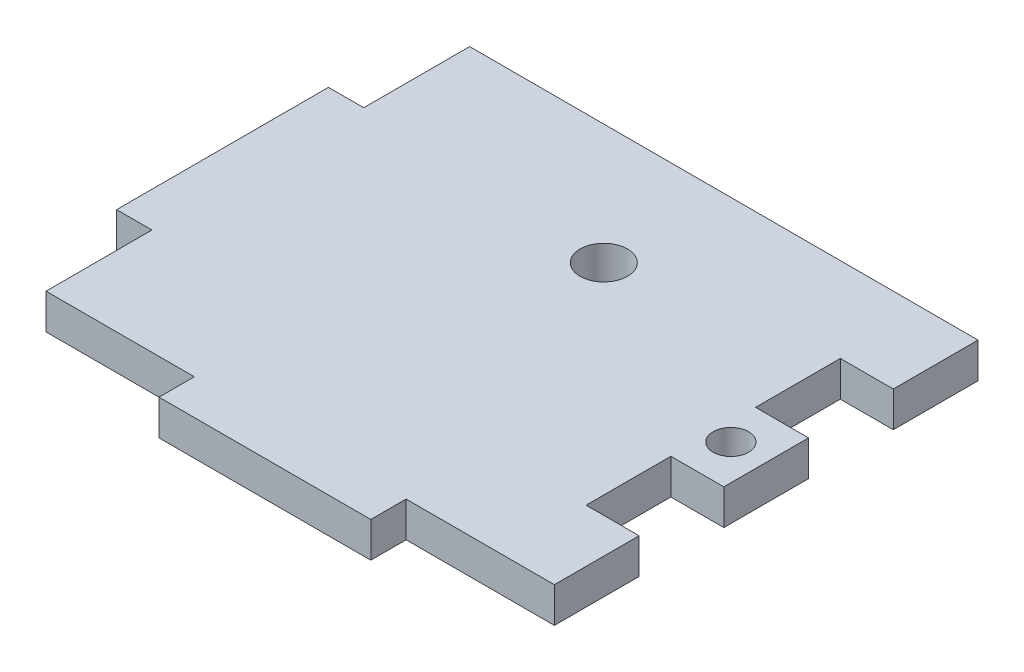
ISO-10303-21;
HEADER;
FILE_DESCRIPTION(('STEP AP214'),'2;1');
FILE_NAME('part.step','',(''),(''),'','','');
FILE_SCHEMA(('AUTOMOTIVE_DESIGN { 1 0 10303 214 1 1 1 1 }'));
ENDSEC;
DATA;
#1=APPLICATION_CONTEXT('core data for automotive mechanical design processes');
#2=APPLICATION_PROTOCOL_DEFINITION('international standard','automotive_design',2000,#1);
#3=PRODUCT_CONTEXT('',#1,'mechanical');
#4=PRODUCT('Part','Part','',(#3));
#5=PRODUCT_RELATED_PRODUCT_CATEGORY('part','',(#4));
#6=PRODUCT_DEFINITION_FORMATION('','',#4);
#7=PRODUCT_DEFINITION_CONTEXT('part definition',#1,'design');
#8=PRODUCT_DEFINITION('design','',#6,#7);
#9=PRODUCT_DEFINITION_SHAPE('','',#8);
#10=(LENGTH_UNIT() NAMED_UNIT(*) SI_UNIT(.MILLI.,.METRE.));
#11=(NAMED_UNIT(*) PLANE_ANGLE_UNIT() SI_UNIT($,.RADIAN.));
#12=(NAMED_UNIT(*) SI_UNIT($,.STERADIAN.) SOLID_ANGLE_UNIT());
#13=UNCERTAINTY_MEASURE_WITH_UNIT(LENGTH_MEASURE(1.E-05),#10,'distance_accuracy_value','');
#14=(GEOMETRIC_REPRESENTATION_CONTEXT(3) GLOBAL_UNCERTAINTY_ASSIGNED_CONTEXT((#13)) GLOBAL_UNIT_ASSIGNED_CONTEXT((#10,
#11,#12)) REPRESENTATION_CONTEXT('',''));
#15=CARTESIAN_POINT('',(0.,0.,0.));
#16=DIRECTION('',(0.,0.,1.));
#17=DIRECTION('',(1.,0.,0.));
#18=AXIS2_PLACEMENT_3D('',#15,#16,#17);
#19=CARTESIAN_POINT('',(0.,3.175,-9.525));
#20=DIRECTION('',(1.,0.,0.));
#21=DIRECTION('',(0.,0.,-1.));
#22=AXIS2_PLACEMENT_3D('',#19,#20,#21);
#23=PLANE('',#22);
#24=DIRECTION('',(0.,0.,1.));
#25=VECTOR('',#24,1.);
#26=CARTESIAN_POINT('',(0.,0.,-9.525));
#27=LINE('',#26,#25);
#28=CARTESIAN_POINT('',(0.,0.,-9.525));
#29=VERTEX_POINT('',#28);
#30=CARTESIAN_POINT('',(0.,0.,0.));
#31=VERTEX_POINT('',#30);
#32=EDGE_CURVE('E201',#29,#31,#27,.T.);
#33=ORIENTED_EDGE('',*,*,#32,.T.);
#34=DIRECTION('',(0.,-1.,0.));
#35=VECTOR('',#34,1.);
#36=CARTESIAN_POINT('',(0.,3.175,0.));
#37=LINE('',#36,#35);
#38=CARTESIAN_POINT('',(0.,3.175,0.));
#39=VERTEX_POINT('',#38);
#40=EDGE_CURVE('E11',#39,#31,#37,.T.);
#41=ORIENTED_EDGE('',*,*,#40,.F.);
#42=DIRECTION('',(0.,0.,1.));
#43=VECTOR('',#42,1.);
#44=CARTESIAN_POINT('',(0.,3.175,-9.525));
#45=LINE('',#44,#43);
#46=CARTESIAN_POINT('',(0.,3.175,-9.525));
#47=VERTEX_POINT('',#46);
#48=EDGE_CURVE('E240',#47,#39,#45,.T.);
#49=ORIENTED_EDGE('',*,*,#48,.F.);
#50=DIRECTION('',(0.,-1.,0.));
#51=VECTOR('',#50,1.);
#52=CARTESIAN_POINT('',(0.,3.175,-9.525));
#53=LINE('',#52,#51);
#54=EDGE_CURVE('E197',#47,#29,#53,.T.);
#55=ORIENTED_EDGE('',*,*,#54,.T.);
#56=EDGE_LOOP('',(#33,#41,#49,#55));
#57=FACE_BOUND('',#56,.T.);
#58=ADVANCED_FACE('F33',(#57),#23,.F.);
#59=CARTESIAN_POINT('',(0.,3.175,0.));
#60=DIRECTION('',(0.,0.,-1.));
#61=DIRECTION('',(-1.,0.,0.));
#62=AXIS2_PLACEMENT_3D('',#59,#60,#61);
#63=PLANE('',#62);
#64=DIRECTION('',(1.,0.,0.));
#65=VECTOR('',#64,1.);
#66=CARTESIAN_POINT('',(0.,0.,0.));
#67=LINE('',#66,#65);
#68=CARTESIAN_POINT('',(13.335,0.,0.));
#69=VERTEX_POINT('',#68);
#70=EDGE_CURVE('E204',#31,#69,#67,.T.);
#71=ORIENTED_EDGE('',*,*,#70,.T.);
#72=DIRECTION('',(0.,-1.,0.));
#73=VECTOR('',#72,1.);
#74=CARTESIAN_POINT('',(13.335,3.175,0.));
#75=LINE('',#74,#73);
#76=CARTESIAN_POINT('',(13.335,3.175,0.));
#77=VERTEX_POINT('',#76);
#78=EDGE_CURVE('E41',#77,#69,#75,.T.);
#79=ORIENTED_EDGE('',*,*,#78,.F.);
#80=DIRECTION('',(1.,0.,0.));
#81=VECTOR('',#80,1.);
#82=CARTESIAN_POINT('',(0.,3.175,0.));
#83=LINE('',#82,#81);
#84=EDGE_CURVE('E128',#39,#77,#83,.T.);
#85=ORIENTED_EDGE('',*,*,#84,.F.);
#86=ORIENTED_EDGE('',*,*,#40,.T.);
#87=EDGE_LOOP('',(#71,#79,#85,#86));
#88=FACE_BOUND('',#87,.T.);
#89=ADVANCED_FACE('F359',(#88),#63,.F.);
#90=CARTESIAN_POINT('',(13.335,3.175,0.));
#91=DIRECTION('',(1.,0.,0.));
#92=DIRECTION('',(0.,0.,-1.));
#93=AXIS2_PLACEMENT_3D('',#90,#91,#92);
#94=PLANE('',#93);
#95=DIRECTION('',(0.,0.,1.));
#96=VECTOR('',#95,1.);
#97=CARTESIAN_POINT('',(13.335,0.,0.));
#98=LINE('',#97,#96);
#99=CARTESIAN_POINT('',(13.335,0.,3.175));
#100=VERTEX_POINT('',#99);
#101=EDGE_CURVE('E207',#69,#100,#98,.T.);
#102=ORIENTED_EDGE('',*,*,#101,.T.);
#103=DIRECTION('',(0.,-1.,0.));
#104=VECTOR('',#103,1.);
#105=CARTESIAN_POINT('',(13.335,3.175,3.175));
#106=LINE('',#105,#104);
#107=CARTESIAN_POINT('',(13.335,3.175,3.175));
#108=VERTEX_POINT('',#107);
#109=EDGE_CURVE('E283',#108,#100,#106,.T.);
#110=ORIENTED_EDGE('',*,*,#109,.F.);
#111=DIRECTION('',(0.,0.,1.));
#112=VECTOR('',#111,1.);
#113=CARTESIAN_POINT('',(13.335,3.175,0.));
#114=LINE('',#113,#112);
#115=EDGE_CURVE('E291',#77,#108,#114,.T.);
#116=ORIENTED_EDGE('',*,*,#115,.F.);
#117=ORIENTED_EDGE('',*,*,#78,.T.);
#118=EDGE_LOOP('',(#102,#110,#116,#117));
#119=FACE_BOUND('',#118,.T.);
#120=ADVANCED_FACE('F289',(#119),#94,.F.);
#121=CARTESIAN_POINT('',(13.335,3.175,3.175));
#122=DIRECTION('',(0.,0.,-1.));
#123=DIRECTION('',(-1.,0.,0.));
#124=AXIS2_PLACEMENT_3D('',#121,#122,#123);
#125=PLANE('',#124);
#126=DIRECTION('',(1.,0.,0.));
#127=VECTOR('',#126,1.);
#128=CARTESIAN_POINT('',(13.335,0.,3.175));
#129=LINE('',#128,#127);
#130=CARTESIAN_POINT('',(32.385,0.,3.175));
#131=VERTEX_POINT('',#130);
#132=EDGE_CURVE('E209',#100,#131,#129,.T.);
#133=ORIENTED_EDGE('',*,*,#132,.T.);
#134=DIRECTION('',(0.,-1.,0.));
#135=VECTOR('',#134,1.);
#136=CARTESIAN_POINT('',(32.385,3.175,3.175));
#137=LINE('',#136,#135);
#138=CARTESIAN_POINT('',(32.385,3.175,3.175));
#139=VERTEX_POINT('',#138);
#140=EDGE_CURVE('E280',#139,#131,#137,.T.);
#141=ORIENTED_EDGE('',*,*,#140,.F.);
#142=DIRECTION('',(1.,0.,0.));
#143=VECTOR('',#142,1.);
#144=CARTESIAN_POINT('',(13.335,3.175,3.175));
#145=LINE('',#144,#143);
#146=EDGE_CURVE('E309',#108,#139,#145,.T.);
#147=ORIENTED_EDGE('',*,*,#146,.F.);
#148=ORIENTED_EDGE('',*,*,#109,.T.);
#149=EDGE_LOOP('',(#133,#141,#147,#148));
#150=FACE_BOUND('',#149,.T.);
#151=ADVANCED_FACE('F300',(#150),#125,.F.);
#152=CARTESIAN_POINT('',(32.385,3.175,3.175));
#153=DIRECTION('',(-1.,0.,0.));
#154=DIRECTION('',(0.,0.,1.));
#155=AXIS2_PLACEMENT_3D('',#152,#153,#154);
#156=PLANE('',#155);
#157=DIRECTION('',(0.,0.,-1.));
#158=VECTOR('',#157,1.);
#159=CARTESIAN_POINT('',(32.385,0.,3.175));
#160=LINE('',#159,#158);
#161=CARTESIAN_POINT('',(32.385,0.,0.));
#162=VERTEX_POINT('',#161);
#163=EDGE_CURVE('E211',#131,#162,#160,.T.);
#164=ORIENTED_EDGE('',*,*,#163,.T.);
#165=DIRECTION('',(0.,-1.,0.));
#166=VECTOR('',#165,1.);
#167=CARTESIAN_POINT('',(32.385,3.175,0.));
#168=LINE('',#167,#166);
#169=CARTESIAN_POINT('',(32.385,3.175,0.));
#170=VERTEX_POINT('',#169);
#171=EDGE_CURVE('E277',#170,#162,#168,.T.);
#172=ORIENTED_EDGE('',*,*,#171,.F.);
#173=DIRECTION('',(0.,0.,-1.));
#174=VECTOR('',#173,1.);
#175=CARTESIAN_POINT('',(32.385,3.175,3.175));
#176=LINE('',#175,#174);
#177=EDGE_CURVE('E306',#139,#170,#176,.T.);
#178=ORIENTED_EDGE('',*,*,#177,.F.);
#179=ORIENTED_EDGE('',*,*,#140,.T.);
#180=EDGE_LOOP('',(#164,#172,#178,#179));
#181=FACE_BOUND('',#180,.T.);
#182=ADVANCED_FACE('F304',(#181),#156,.F.);
#183=CARTESIAN_POINT('',(32.385,3.175,0.));
#184=DIRECTION('',(0.,0.,-1.));
#185=DIRECTION('',(-1.,0.,0.));
#186=AXIS2_PLACEMENT_3D('',#183,#184,#185);
#187=PLANE('',#186);
#188=DIRECTION('',(1.,0.,0.));
#189=VECTOR('',#188,1.);
#190=CARTESIAN_POINT('',(32.385,0.,0.));
#191=LINE('',#190,#189);
#192=CARTESIAN_POINT('',(45.72,0.,0.));
#193=VERTEX_POINT('',#192);
#194=EDGE_CURVE('E213',#162,#193,#191,.T.);
#195=ORIENTED_EDGE('',*,*,#194,.T.);
#196=DIRECTION('',(0.,-1.,0.));
#197=VECTOR('',#196,1.);
#198=CARTESIAN_POINT('',(45.72,3.175,0.));
#199=LINE('',#198,#197);
#200=CARTESIAN_POINT('',(45.72,3.175,0.));
#201=VERTEX_POINT('',#200);
#202=EDGE_CURVE('E274',#201,#193,#199,.T.);
#203=ORIENTED_EDGE('',*,*,#202,.F.);
#204=DIRECTION('',(1.,0.,0.));
#205=VECTOR('',#204,1.);
#206=CARTESIAN_POINT('',(32.385,3.175,0.));
#207=LINE('',#206,#205);
#208=EDGE_CURVE('E308',#170,#201,#207,.T.);
#209=ORIENTED_EDGE('',*,*,#208,.F.);
#210=ORIENTED_EDGE('',*,*,#171,.T.);
#211=EDGE_LOOP('',(#195,#203,#209,#210));
#212=FACE_BOUND('',#211,.T.);
#213=ADVANCED_FACE('F372',(#212),#187,.F.);
#214=CARTESIAN_POINT('',(45.72,3.175,0.));
#215=DIRECTION('',(-1.,0.,0.));
#216=DIRECTION('',(0.,0.,1.));
#217=AXIS2_PLACEMENT_3D('',#214,#215,#216);
#218=PLANE('',#217);
#219=DIRECTION('',(0.,0.,-1.));
#220=VECTOR('',#219,1.);
#221=CARTESIAN_POINT('',(45.72,0.,0.));
#222=LINE('',#221,#220);
#223=CARTESIAN_POINT('',(45.72,0.,-7.62));
#224=VERTEX_POINT('',#223);
#225=EDGE_CURVE('E215',#193,#224,#222,.T.);
#226=ORIENTED_EDGE('',*,*,#225,.T.);
#227=DIRECTION('',(0.,-1.,0.));
#228=VECTOR('',#227,1.);
#229=CARTESIAN_POINT('',(45.72,3.175,-7.62));
#230=LINE('',#229,#228);
#231=CARTESIAN_POINT('',(45.72,3.175,-7.62));
#232=VERTEX_POINT('',#231);
#233=EDGE_CURVE('E271',#232,#224,#230,.T.);
#234=ORIENTED_EDGE('',*,*,#233,.F.);
#235=DIRECTION('',(0.,0.,-1.));
#236=VECTOR('',#235,1.);
#237=CARTESIAN_POINT('',(45.72,3.175,0.));
#238=LINE('',#237,#236);
#239=EDGE_CURVE('E311',#201,#232,#238,.T.);
#240=ORIENTED_EDGE('',*,*,#239,.F.);
#241=ORIENTED_EDGE('',*,*,#202,.T.);
#242=EDGE_LOOP('',(#226,#234,#240,#241));
#243=FACE_BOUND('',#242,.T.);
#244=ADVANCED_FACE('F375',(#243),#218,.F.);
#245=CARTESIAN_POINT('',(40.9575,3.175,-7.62));
#246=DIRECTION('',(0.,0.,1.));
#247=DIRECTION('',(1.,0.,0.));
#248=AXIS2_PLACEMENT_3D('',#245,#246,#247);
#249=PLANE('',#248);
#250=DIRECTION('',(-1.,0.,0.));
#251=VECTOR('',#250,1.);
#252=CARTESIAN_POINT('',(40.9575,0.,-7.62));
#253=LINE('',#252,#251);
#254=CARTESIAN_POINT('',(40.9575,0.,-7.62));
#255=VERTEX_POINT('',#254);
#256=EDGE_CURVE('E217',#224,#255,#253,.T.);
#257=ORIENTED_EDGE('',*,*,#256,.T.);
#258=DIRECTION('',(0.,-1.,0.));
#259=VECTOR('',#258,1.);
#260=CARTESIAN_POINT('',(40.9575,3.175,-7.62));
#261=LINE('',#260,#259);
#262=CARTESIAN_POINT('',(40.9575,3.175,-7.62));
#263=VERTEX_POINT('',#262);
#264=EDGE_CURVE('E268',#263,#255,#261,.T.);
#265=ORIENTED_EDGE('',*,*,#264,.F.);
#266=DIRECTION('',(-1.,0.,0.));
#267=VECTOR('',#266,1.);
#268=CARTESIAN_POINT('',(40.9575,3.175,-7.62));
#269=LINE('',#268,#267);
#270=EDGE_CURVE('E317',#232,#263,#269,.T.);
#271=ORIENTED_EDGE('',*,*,#270,.F.);
#272=ORIENTED_EDGE('',*,*,#233,.T.);
#273=EDGE_LOOP('',(#257,#265,#271,#272));
#274=FACE_BOUND('',#273,.T.);
#275=ADVANCED_FACE('F379',(#274),#249,.F.);
#276=CARTESIAN_POINT('',(40.9575,3.175,-15.24));
#277=DIRECTION('',(-1.,0.,0.));
#278=DIRECTION('',(0.,0.,1.));
#279=AXIS2_PLACEMENT_3D('',#276,#277,#278);
#280=PLANE('',#279);
#281=DIRECTION('',(0.,0.,-1.));
#282=VECTOR('',#281,1.);
#283=CARTESIAN_POINT('',(40.9575,0.,-15.24));
#284=LINE('',#283,#282);
#285=CARTESIAN_POINT('',(40.9575,0.,-15.24));
#286=VERTEX_POINT('',#285);
#287=EDGE_CURVE('E219',#255,#286,#284,.T.);
#288=ORIENTED_EDGE('',*,*,#287,.T.);
#289=DIRECTION('',(0.,-1.,0.));
#290=VECTOR('',#289,1.);
#291=CARTESIAN_POINT('',(40.9575,3.175,-15.24));
#292=LINE('',#291,#290);
#293=CARTESIAN_POINT('',(40.9575,3.175,-15.24));
#294=VERTEX_POINT('',#293);
#295=EDGE_CURVE('E265',#294,#286,#292,.T.);
#296=ORIENTED_EDGE('',*,*,#295,.F.);
#297=DIRECTION('',(0.,0.,-1.));
#298=VECTOR('',#297,1.);
#299=CARTESIAN_POINT('',(40.9575,3.175,-15.24));
#300=LINE('',#299,#298);
#301=EDGE_CURVE('E319',#263,#294,#300,.T.);
#302=ORIENTED_EDGE('',*,*,#301,.F.);
#303=ORIENTED_EDGE('',*,*,#264,.T.);
#304=EDGE_LOOP('',(#288,#296,#302,#303));
#305=FACE_BOUND('',#304,.T.);
#306=ADVANCED_FACE('F383',(#305),#280,.F.);
#307=CARTESIAN_POINT('',(40.9575,3.175,-15.24));
#308=DIRECTION('',(0.,0.,-1.));
#309=DIRECTION('',(-1.,0.,0.));
#310=AXIS2_PLACEMENT_3D('',#307,#308,#309);
#311=PLANE('',#310);
#312=DIRECTION('',(1.,0.,0.));
#313=VECTOR('',#312,1.);
#314=CARTESIAN_POINT('',(40.9575,0.,-15.24));
#315=LINE('',#314,#313);
#316=CARTESIAN_POINT('',(45.72,0.,-15.24));
#317=VERTEX_POINT('',#316);
#318=EDGE_CURVE('E221',#286,#317,#315,.T.);
#319=ORIENTED_EDGE('',*,*,#318,.T.);
#320=DIRECTION('',(0.,-1.,0.));
#321=VECTOR('',#320,1.);
#322=CARTESIAN_POINT('',(45.72,3.175,-15.24));
#323=LINE('',#322,#321);
#324=CARTESIAN_POINT('',(45.72,3.175,-15.24));
#325=VERTEX_POINT('',#324);
#326=EDGE_CURVE('E262',#325,#317,#323,.T.);
#327=ORIENTED_EDGE('',*,*,#326,.F.);
#328=DIRECTION('',(1.,0.,0.));
#329=VECTOR('',#328,1.);
#330=CARTESIAN_POINT('',(40.9575,3.175,-15.24));
#331=LINE('',#330,#329);
#332=EDGE_CURVE('E321',#294,#325,#331,.T.);
#333=ORIENTED_EDGE('',*,*,#332,.F.);
#334=ORIENTED_EDGE('',*,*,#295,.T.);
#335=EDGE_LOOP('',(#319,#327,#333,#334));
#336=FACE_BOUND('',#335,.T.);
#337=ADVANCED_FACE('F387',(#336),#311,.F.);
#338=CARTESIAN_POINT('',(45.72,3.175,-15.24));
#339=DIRECTION('',(-1.,0.,0.));
#340=DIRECTION('',(0.,0.,1.));
#341=AXIS2_PLACEMENT_3D('',#338,#339,#340);
#342=PLANE('',#341);
#343=DIRECTION('',(0.,0.,-1.));
#344=VECTOR('',#343,1.);
#345=CARTESIAN_POINT('',(45.72,0.,-15.24));
#346=LINE('',#345,#344);
#347=CARTESIAN_POINT('',(45.72,0.,-22.86));
#348=VERTEX_POINT('',#347);
#349=EDGE_CURVE('E223',#317,#348,#346,.T.);
#350=ORIENTED_EDGE('',*,*,#349,.T.);
#351=DIRECTION('',(0.,-1.,0.));
#352=VECTOR('',#351,1.);
#353=CARTESIAN_POINT('',(45.72,3.175,-22.86));
#354=LINE('',#353,#352);
#355=CARTESIAN_POINT('',(45.72,3.175,-22.86));
#356=VERTEX_POINT('',#355);
#357=EDGE_CURVE('E259',#356,#348,#354,.T.);
#358=ORIENTED_EDGE('',*,*,#357,.F.);
#359=DIRECTION('',(0.,0.,-1.));
#360=VECTOR('',#359,1.);
#361=CARTESIAN_POINT('',(45.72,3.175,-15.24));
#362=LINE('',#361,#360);
#363=EDGE_CURVE('E323',#325,#356,#362,.T.);
#364=ORIENTED_EDGE('',*,*,#363,.F.);
#365=ORIENTED_EDGE('',*,*,#326,.T.);
#366=EDGE_LOOP('',(#350,#358,#364,#365));
#367=FACE_BOUND('',#366,.T.);
#368=ADVANCED_FACE('F391',(#367),#342,.F.);
#369=CARTESIAN_POINT('',(40.9575,3.175,-22.86));
#370=DIRECTION('',(0.,0.,1.));
#371=DIRECTION('',(1.,0.,0.));
#372=AXIS2_PLACEMENT_3D('',#369,#370,#371);
#373=PLANE('',#372);
#374=DIRECTION('',(-1.,0.,0.));
#375=VECTOR('',#374,1.);
#376=CARTESIAN_POINT('',(40.9575,0.,-22.86));
#377=LINE('',#376,#375);
#378=CARTESIAN_POINT('',(40.9575,0.,-22.86));
#379=VERTEX_POINT('',#378);
#380=EDGE_CURVE('E225',#348,#379,#377,.T.);
#381=ORIENTED_EDGE('',*,*,#380,.T.);
#382=DIRECTION('',(0.,-1.,0.));
#383=VECTOR('',#382,1.);
#384=CARTESIAN_POINT('',(40.9575,3.175,-22.86));
#385=LINE('',#384,#383);
#386=CARTESIAN_POINT('',(40.9575,3.175,-22.86));
#387=VERTEX_POINT('',#386);
#388=EDGE_CURVE('E256',#387,#379,#385,.T.);
#389=ORIENTED_EDGE('',*,*,#388,.F.);
#390=DIRECTION('',(-1.,0.,0.));
#391=VECTOR('',#390,1.);
#392=CARTESIAN_POINT('',(40.9575,3.175,-22.86));
#393=LINE('',#392,#391);
#394=EDGE_CURVE('E325',#356,#387,#393,.T.);
#395=ORIENTED_EDGE('',*,*,#394,.F.);
#396=ORIENTED_EDGE('',*,*,#357,.T.);
#397=EDGE_LOOP('',(#381,#389,#395,#396));
#398=FACE_BOUND('',#397,.T.);
#399=ADVANCED_FACE('F395',(#398),#373,.F.);
#400=CARTESIAN_POINT('',(40.9575,3.175,-30.48));
#401=DIRECTION('',(-1.,0.,0.));
#402=DIRECTION('',(0.,0.,1.));
#403=AXIS2_PLACEMENT_3D('',#400,#401,#402);
#404=PLANE('',#403);
#405=DIRECTION('',(0.,0.,-1.));
#406=VECTOR('',#405,1.);
#407=CARTESIAN_POINT('',(40.9575,0.,-30.48));
#408=LINE('',#407,#406);
#409=CARTESIAN_POINT('',(40.9575,0.,-30.48));
#410=VERTEX_POINT('',#409);
#411=EDGE_CURVE('E227',#379,#410,#408,.T.);
#412=ORIENTED_EDGE('',*,*,#411,.T.);
#413=DIRECTION('',(0.,-1.,0.));
#414=VECTOR('',#413,1.);
#415=CARTESIAN_POINT('',(40.9575,3.175,-30.48));
#416=LINE('',#415,#414);
#417=CARTESIAN_POINT('',(40.9575,3.175,-30.48));
#418=VERTEX_POINT('',#417);
#419=EDGE_CURVE('E253',#418,#410,#416,.T.);
#420=ORIENTED_EDGE('',*,*,#419,.F.);
#421=DIRECTION('',(0.,0.,-1.));
#422=VECTOR('',#421,1.);
#423=CARTESIAN_POINT('',(40.9575,3.175,-30.48));
#424=LINE('',#423,#422);
#425=EDGE_CURVE('E327',#387,#418,#424,.T.);
#426=ORIENTED_EDGE('',*,*,#425,.F.);
#427=ORIENTED_EDGE('',*,*,#388,.T.);
#428=EDGE_LOOP('',(#412,#420,#426,#427));
#429=FACE_BOUND('',#428,.T.);
#430=ADVANCED_FACE('F399',(#429),#404,.F.);
#431=CARTESIAN_POINT('',(40.9575,3.175,-30.48));
#432=DIRECTION('',(0.,0.,-1.));
#433=DIRECTION('',(-1.,0.,0.));
#434=AXIS2_PLACEMENT_3D('',#431,#432,#433);
#435=PLANE('',#434);
#436=DIRECTION('',(1.,0.,0.));
#437=VECTOR('',#436,1.);
#438=CARTESIAN_POINT('',(40.9575,0.,-30.48));
#439=LINE('',#438,#437);
#440=CARTESIAN_POINT('',(45.72,0.,-30.48));
#441=VERTEX_POINT('',#440);
#442=EDGE_CURVE('E229',#410,#441,#439,.T.);
#443=ORIENTED_EDGE('',*,*,#442,.T.);
#444=DIRECTION('',(0.,-1.,0.));
#445=VECTOR('',#444,1.);
#446=CARTESIAN_POINT('',(45.72,3.175,-30.48));
#447=LINE('',#446,#445);
#448=CARTESIAN_POINT('',(45.72,3.175,-30.48));
#449=VERTEX_POINT('',#448);
#450=EDGE_CURVE('E250',#449,#441,#447,.T.);
#451=ORIENTED_EDGE('',*,*,#450,.F.);
#452=DIRECTION('',(1.,0.,0.));
#453=VECTOR('',#452,1.);
#454=CARTESIAN_POINT('',(40.9575,3.175,-30.48));
#455=LINE('',#454,#453);
#456=EDGE_CURVE('E329',#418,#449,#455,.T.);
#457=ORIENTED_EDGE('',*,*,#456,.F.);
#458=ORIENTED_EDGE('',*,*,#419,.T.);
#459=EDGE_LOOP('',(#443,#451,#457,#458));
#460=FACE_BOUND('',#459,.T.);
#461=ADVANCED_FACE('F403',(#460),#435,.F.);
#462=CARTESIAN_POINT('',(45.72,3.175,-30.48));
#463=DIRECTION('',(-1.,0.,0.));
#464=DIRECTION('',(0.,0.,1.));
#465=AXIS2_PLACEMENT_3D('',#462,#463,#464);
#466=PLANE('',#465);
#467=DIRECTION('',(0.,0.,-1.));
#468=VECTOR('',#467,1.);
#469=CARTESIAN_POINT('',(45.72,0.,-30.48));
#470=LINE('',#469,#468);
#471=CARTESIAN_POINT('',(45.72,0.,-38.1));
#472=VERTEX_POINT('',#471);
#473=EDGE_CURVE('E231',#441,#472,#470,.T.);
#474=ORIENTED_EDGE('',*,*,#473,.T.);
#475=DIRECTION('',(0.,-1.,0.));
#476=VECTOR('',#475,1.);
#477=CARTESIAN_POINT('',(45.72,3.175,-38.1));
#478=LINE('',#477,#476);
#479=CARTESIAN_POINT('',(45.72,3.175,-38.1));
#480=VERTEX_POINT('',#479);
#481=EDGE_CURVE('E247',#480,#472,#478,.T.);
#482=ORIENTED_EDGE('',*,*,#481,.F.);
#483=DIRECTION('',(0.,0.,-1.));
#484=VECTOR('',#483,1.);
#485=CARTESIAN_POINT('',(45.72,3.175,-30.48));
#486=LINE('',#485,#484);
#487=EDGE_CURVE('E331',#449,#480,#486,.T.);
#488=ORIENTED_EDGE('',*,*,#487,.F.);
#489=ORIENTED_EDGE('',*,*,#450,.T.);
#490=EDGE_LOOP('',(#474,#482,#488,#489));
#491=FACE_BOUND('',#490,.T.);
#492=ADVANCED_FACE('F407',(#491),#466,.F.);
#493=CARTESIAN_POINT('',(45.72,3.175,-38.1));
#494=DIRECTION('',(0.,0.,1.));
#495=DIRECTION('',(1.,0.,0.));
#496=AXIS2_PLACEMENT_3D('',#493,#494,#495);
#497=PLANE('',#496);
#498=DIRECTION('',(-1.,0.,0.));
#499=VECTOR('',#498,1.);
#500=CARTESIAN_POINT('',(45.72,0.,-38.1));
#501=LINE('',#500,#499);
#502=CARTESIAN_POINT('',(0.,0.,-38.1));
#503=VERTEX_POINT('',#502);
#504=EDGE_CURVE('E233',#472,#503,#501,.T.);
#505=ORIENTED_EDGE('',*,*,#504,.T.);
#506=DIRECTION('',(0.,-1.,0.));
#507=VECTOR('',#506,1.);
#508=CARTESIAN_POINT('',(0.,3.175,-38.1));
#509=LINE('',#508,#507);
#510=CARTESIAN_POINT('',(0.,3.175,-38.1));
#511=VERTEX_POINT('',#510);
#512=EDGE_CURVE('E244',#511,#503,#509,.T.);
#513=ORIENTED_EDGE('',*,*,#512,.F.);
#514=DIRECTION('',(-1.,0.,0.));
#515=VECTOR('',#514,1.);
#516=CARTESIAN_POINT('',(45.72,3.175,-38.1));
#517=LINE('',#516,#515);
#518=EDGE_CURVE('E333',#480,#511,#517,.T.);
#519=ORIENTED_EDGE('',*,*,#518,.F.);
#520=ORIENTED_EDGE('',*,*,#481,.T.);
#521=EDGE_LOOP('',(#505,#513,#519,#520));
#522=FACE_BOUND('',#521,.T.);
#523=ADVANCED_FACE('F339',(#522),#497,.F.);
#524=CARTESIAN_POINT('',(0.,3.175,-38.1));
#525=DIRECTION('',(1.,0.,0.));
#526=DIRECTION('',(0.,0.,-1.));
#527=AXIS2_PLACEMENT_3D('',#524,#525,#526);
#528=PLANE('',#527);
#529=DIRECTION('',(0.,0.,1.));
#530=VECTOR('',#529,1.);
#531=CARTESIAN_POINT('',(0.,0.,-38.1));
#532=LINE('',#531,#530);
#533=CARTESIAN_POINT('',(0.,0.,-28.575));
#534=VERTEX_POINT('',#533);
#535=EDGE_CURVE('E235',#503,#534,#532,.T.);
#536=ORIENTED_EDGE('',*,*,#535,.T.);
#537=DIRECTION('',(0.,-1.,0.));
#538=VECTOR('',#537,1.);
#539=CARTESIAN_POINT('',(0.,3.175,-28.575));
#540=LINE('',#539,#538);
#541=CARTESIAN_POINT('',(0.,3.175,-28.575));
#542=VERTEX_POINT('',#541);
#543=EDGE_CURVE('E192',#542,#534,#540,.T.);
#544=ORIENTED_EDGE('',*,*,#543,.F.);
#545=DIRECTION('',(0.,0.,1.));
#546=VECTOR('',#545,1.);
#547=CARTESIAN_POINT('',(0.,3.175,-38.1));
#548=LINE('',#547,#546);
#549=EDGE_CURVE('E183',#511,#542,#548,.T.);
#550=ORIENTED_EDGE('',*,*,#549,.F.);
#551=ORIENTED_EDGE('',*,*,#512,.T.);
#552=EDGE_LOOP('',(#536,#544,#550,#551));
#553=FACE_BOUND('',#552,.T.);
#554=ADVANCED_FACE('F343',(#553),#528,.F.);
#555=CARTESIAN_POINT('',(0.,3.175,-28.575));
#556=DIRECTION('',(0.,0.,1.));
#557=DIRECTION('',(1.,0.,0.));
#558=AXIS2_PLACEMENT_3D('',#555,#556,#557);
#559=PLANE('',#558);
#560=DIRECTION('',(-1.,0.,0.));
#561=VECTOR('',#560,1.);
#562=CARTESIAN_POINT('',(0.,0.,-28.575));
#563=LINE('',#562,#561);
#564=CARTESIAN_POINT('',(-3.175,0.,-28.575));
#565=VERTEX_POINT('',#564);
#566=EDGE_CURVE('E191',#534,#565,#563,.T.);
#567=ORIENTED_EDGE('',*,*,#566,.T.);
#568=DIRECTION('',(0.,-1.,0.));
#569=VECTOR('',#568,1.);
#570=CARTESIAN_POINT('',(-3.175,3.175,-28.575));
#571=LINE('',#570,#569);
#572=CARTESIAN_POINT('',(-3.175,3.175,-28.575));
#573=VERTEX_POINT('',#572);
#574=EDGE_CURVE('E188',#573,#565,#571,.T.);
#575=ORIENTED_EDGE('',*,*,#574,.F.);
#576=DIRECTION('',(-1.,0.,0.));
#577=VECTOR('',#576,1.);
#578=CARTESIAN_POINT('',(0.,3.175,-28.575));
#579=LINE('',#578,#577);
#580=EDGE_CURVE('E177',#542,#573,#579,.T.);
#581=ORIENTED_EDGE('',*,*,#580,.F.);
#582=ORIENTED_EDGE('',*,*,#543,.T.);
#583=EDGE_LOOP('',(#567,#575,#581,#582));
#584=FACE_BOUND('',#583,.T.);
#585=ADVANCED_FACE('F189',(#584),#559,.F.);
#586=CARTESIAN_POINT('',(-3.175,3.175,-28.575));
#587=DIRECTION('',(1.,0.,0.));
#588=DIRECTION('',(0.,0.,-1.));
#589=AXIS2_PLACEMENT_3D('',#586,#587,#588);
#590=PLANE('',#589);
#591=DIRECTION('',(0.,0.,1.));
#592=VECTOR('',#591,1.);
#593=CARTESIAN_POINT('',(-3.175,0.,-28.575));
#594=LINE('',#593,#592);
#595=CARTESIAN_POINT('',(-3.17499999999999,0.,-9.525));
#596=VERTEX_POINT('',#595);
#597=EDGE_CURVE('E114',#565,#596,#594,.T.);
#598=ORIENTED_EDGE('',*,*,#597,.T.);
#599=DIRECTION('',(0.,-1.,0.));
#600=VECTOR('',#599,1.);
#601=CARTESIAN_POINT('',(-3.17499999999999,3.175,-9.525));
#602=LINE('',#601,#600);
#603=CARTESIAN_POINT('',(-3.17499999999999,3.175,-9.525));
#604=VERTEX_POINT('',#603);
#605=EDGE_CURVE('E193',#604,#596,#602,.T.);
#606=ORIENTED_EDGE('',*,*,#605,.F.);
#607=DIRECTION('',(0.,0.,1.));
#608=VECTOR('',#607,1.);
#609=CARTESIAN_POINT('',(-3.175,3.175,-28.575));
#610=LINE('',#609,#608);
#611=EDGE_CURVE('E181',#573,#604,#610,.T.);
#612=ORIENTED_EDGE('',*,*,#611,.F.);
#613=ORIENTED_EDGE('',*,*,#574,.T.);
#614=EDGE_LOOP('',(#598,#606,#612,#613));
#615=FACE_BOUND('',#614,.T.);
#616=ADVANCED_FACE('F195',(#615),#590,.F.);
#617=CARTESIAN_POINT('',(-3.17499999999999,3.175,-9.525));
#618=DIRECTION('',(0.,0.,-1.));
#619=DIRECTION('',(-1.,0.,0.));
#620=AXIS2_PLACEMENT_3D('',#617,#618,#619);
#621=PLANE('',#620);
#622=DIRECTION('',(1.,0.,0.));
#623=VECTOR('',#622,1.);
#624=CARTESIAN_POINT('',(-3.17499999999999,0.,-9.525));
#625=LINE('',#624,#623);
#626=EDGE_CURVE('E120',#596,#29,#625,.T.);
#627=ORIENTED_EDGE('',*,*,#626,.T.);
#628=ORIENTED_EDGE('',*,*,#54,.F.);
#629=DIRECTION('',(1.,0.,0.));
#630=VECTOR('',#629,1.);
#631=CARTESIAN_POINT('',(-3.17499999999999,3.175,-9.525));
#632=LINE('',#631,#630);
#633=EDGE_CURVE('E49',#604,#47,#632,.T.);
#634=ORIENTED_EDGE('',*,*,#633,.F.);
#635=ORIENTED_EDGE('',*,*,#605,.T.);
#636=EDGE_LOOP('',(#627,#628,#634,#635));
#637=FACE_BOUND('',#636,.T.);
#638=ADVANCED_FACE('F347',(#637),#621,.F.);
#639=CARTESIAN_POINT('',(0.,3.175,0.));
#640=DIRECTION('',(0.,1.,0.));
#641=DIRECTION('',(0.,0.,1.));
#642=AXIS2_PLACEMENT_3D('',#639,#640,#641);
#643=PLANE('',#642);
#644=CARTESIAN_POINT('',(22.86,3.175,-27.305));
#645=DIRECTION('',(0.,1.,0.));
#646=DIRECTION('',(0.,0.,1.));
#647=AXIS2_PLACEMENT_3D('',#644,#645,#646);
#648=CIRCLE('',#647,2.13359999999999);
#649=CARTESIAN_POINT('',(22.86,3.175,-25.1714));
#650=VERTEX_POINT('',#649);
#651=EDGE_CURVE('E477',#650,#650,#648,.T.);
#652=ORIENTED_EDGE('',*,*,#651,.F.);
#653=EDGE_LOOP('',(#652));
#654=FACE_BOUND('',#653,.T.);
#655=CARTESIAN_POINT('',(42.545,3.175,-19.05));
#656=DIRECTION('',(0.,1.,0.));
#657=DIRECTION('',(0.,0.,1.));
#658=AXIS2_PLACEMENT_3D('',#655,#656,#657);
#659=CIRCLE('',#658,1.6);
#660=CARTESIAN_POINT('',(42.545,3.175,-17.45));
#661=VERTEX_POINT('',#660);
#662=EDGE_CURVE('E479',#661,#661,#659,.T.);
#663=ORIENTED_EDGE('',*,*,#662,.F.);
#664=EDGE_LOOP('',(#663));
#665=FACE_BOUND('',#664,.T.);
#666=ORIENTED_EDGE('',*,*,#48,.T.);
#667=ORIENTED_EDGE('',*,*,#84,.T.);
#668=ORIENTED_EDGE('',*,*,#115,.T.);
#669=ORIENTED_EDGE('',*,*,#146,.T.);
#670=ORIENTED_EDGE('',*,*,#177,.T.);
#671=ORIENTED_EDGE('',*,*,#208,.T.);
#672=ORIENTED_EDGE('',*,*,#239,.T.);
#673=ORIENTED_EDGE('',*,*,#270,.T.);
#674=ORIENTED_EDGE('',*,*,#301,.T.);
#675=ORIENTED_EDGE('',*,*,#332,.T.);
#676=ORIENTED_EDGE('',*,*,#363,.T.);
#677=ORIENTED_EDGE('',*,*,#394,.T.);
#678=ORIENTED_EDGE('',*,*,#425,.T.);
#679=ORIENTED_EDGE('',*,*,#456,.T.);
#680=ORIENTED_EDGE('',*,*,#487,.T.);
#681=ORIENTED_EDGE('',*,*,#518,.T.);
#682=ORIENTED_EDGE('',*,*,#549,.T.);
#683=ORIENTED_EDGE('',*,*,#580,.T.);
#684=ORIENTED_EDGE('',*,*,#611,.T.);
#685=ORIENTED_EDGE('',*,*,#633,.T.);
#686=EDGE_LOOP('',(#666,#667,#668,#669,#670,#671,#672,#673,#674,#675,#676,#677,#678,#679,#680,
#681,#682,#683,#684,#685));
#687=FACE_BOUND('',#686,.T.);
#688=ADVANCED_FACE('F179',(#654,#665,#687),#643,.T.);
#689=CARTESIAN_POINT('',(0.,0.,0.));
#690=DIRECTION('',(0.,1.,0.));
#691=DIRECTION('',(0.,0.,1.));
#692=AXIS2_PLACEMENT_3D('',#689,#690,#691);
#693=PLANE('',#692);
#694=CARTESIAN_POINT('',(22.86,0.,-27.305));
#695=DIRECTION('',(0.,1.,0.));
#696=DIRECTION('',(0.,0.,1.));
#697=AXIS2_PLACEMENT_3D('',#694,#695,#696);
#698=CIRCLE('',#697,2.13359999999999);
#699=CARTESIAN_POINT('',(22.86,0.,-25.1714));
#700=VERTEX_POINT('',#699);
#701=EDGE_CURVE('E474',#700,#700,#698,.T.);
#702=ORIENTED_EDGE('',*,*,#701,.T.);
#703=EDGE_LOOP('',(#702));
#704=FACE_BOUND('',#703,.T.);
#705=CARTESIAN_POINT('',(42.545,0.,-19.05));
#706=DIRECTION('',(0.,1.,0.));
#707=DIRECTION('',(0.,0.,1.));
#708=AXIS2_PLACEMENT_3D('',#705,#706,#707);
#709=CIRCLE('',#708,1.6);
#710=CARTESIAN_POINT('',(42.545,0.,-17.45));
#711=VERTEX_POINT('',#710);
#712=EDGE_CURVE('E205',#711,#711,#709,.T.);
#713=ORIENTED_EDGE('',*,*,#712,.T.);
#714=EDGE_LOOP('',(#713));
#715=FACE_BOUND('',#714,.T.);
#716=ORIENTED_EDGE('',*,*,#32,.F.);
#717=ORIENTED_EDGE('',*,*,#626,.F.);
#718=ORIENTED_EDGE('',*,*,#597,.F.);
#719=ORIENTED_EDGE('',*,*,#566,.F.);
#720=ORIENTED_EDGE('',*,*,#535,.F.);
#721=ORIENTED_EDGE('',*,*,#504,.F.);
#722=ORIENTED_EDGE('',*,*,#473,.F.);
#723=ORIENTED_EDGE('',*,*,#442,.F.);
#724=ORIENTED_EDGE('',*,*,#411,.F.);
#725=ORIENTED_EDGE('',*,*,#380,.F.);
#726=ORIENTED_EDGE('',*,*,#349,.F.);
#727=ORIENTED_EDGE('',*,*,#318,.F.);
#728=ORIENTED_EDGE('',*,*,#287,.F.);
#729=ORIENTED_EDGE('',*,*,#256,.F.);
#730=ORIENTED_EDGE('',*,*,#225,.F.);
#731=ORIENTED_EDGE('',*,*,#194,.F.);
#732=ORIENTED_EDGE('',*,*,#163,.F.);
#733=ORIENTED_EDGE('',*,*,#132,.F.);
#734=ORIENTED_EDGE('',*,*,#101,.F.);
#735=ORIENTED_EDGE('',*,*,#70,.F.);
#736=EDGE_LOOP('',(#716,#717,#718,#719,#720,#721,#722,#723,#724,#725,#726,#727,#728,#729,#730,
#731,#732,#733,#734,#735));
#737=FACE_BOUND('',#736,.T.);
#738=ADVANCED_FACE('F295',(#704,#715,#737),#693,.F.);
#739=CARTESIAN_POINT('',(42.545,3.175,-19.05));
#740=DIRECTION('',(0.,1.,0.));
#741=DIRECTION('',(0.,0.,1.));
#742=AXIS2_PLACEMENT_3D('',#739,#740,#741);
#743=CYLINDRICAL_SURFACE('',#742,1.6);
#744=ORIENTED_EDGE('',*,*,#712,.F.);
#745=EDGE_LOOP('',(#744));
#746=FACE_BOUND('',#745,.T.);
#747=ORIENTED_EDGE('',*,*,#662,.T.);
#748=EDGE_LOOP('',(#747));
#749=FACE_BOUND('',#748,.T.);
#750=ADVANCED_FACE('F435',(#746,#749),#743,.F.);
#751=CARTESIAN_POINT('',(22.86,0.,-27.305));
#752=DIRECTION('',(0.,1.,0.));
#753=DIRECTION('',(0.,0.,1.));
#754=AXIS2_PLACEMENT_3D('',#751,#752,#753);
#755=CYLINDRICAL_SURFACE('',#754,2.13359999999999);
#756=ORIENTED_EDGE('',*,*,#701,.F.);
#757=EDGE_LOOP('',(#756));
#758=FACE_BOUND('',#757,.T.);
#759=ORIENTED_EDGE('',*,*,#651,.T.);
#760=EDGE_LOOP('',(#759));
#761=FACE_BOUND('',#760,.T.);
#762=ADVANCED_FACE('F440',(#758,#761),#755,.F.);
#763=CLOSED_SHELL('',(#58,#89,#120,#151,#182,#213,#244,#275,#306,#337,#368,#399,#430,#461,#492,
#523,#554,#585,#616,#638,#688,#738,#750,#762));
#764=MANIFOLD_SOLID_BREP('B2',#763);
#765=ADVANCED_BREP_SHAPE_REPRESENTATION('',(#18,#764),#14);
#766=SHAPE_DEFINITION_REPRESENTATION(#9,#765);
ENDSEC;
END-ISO-10303-21;
